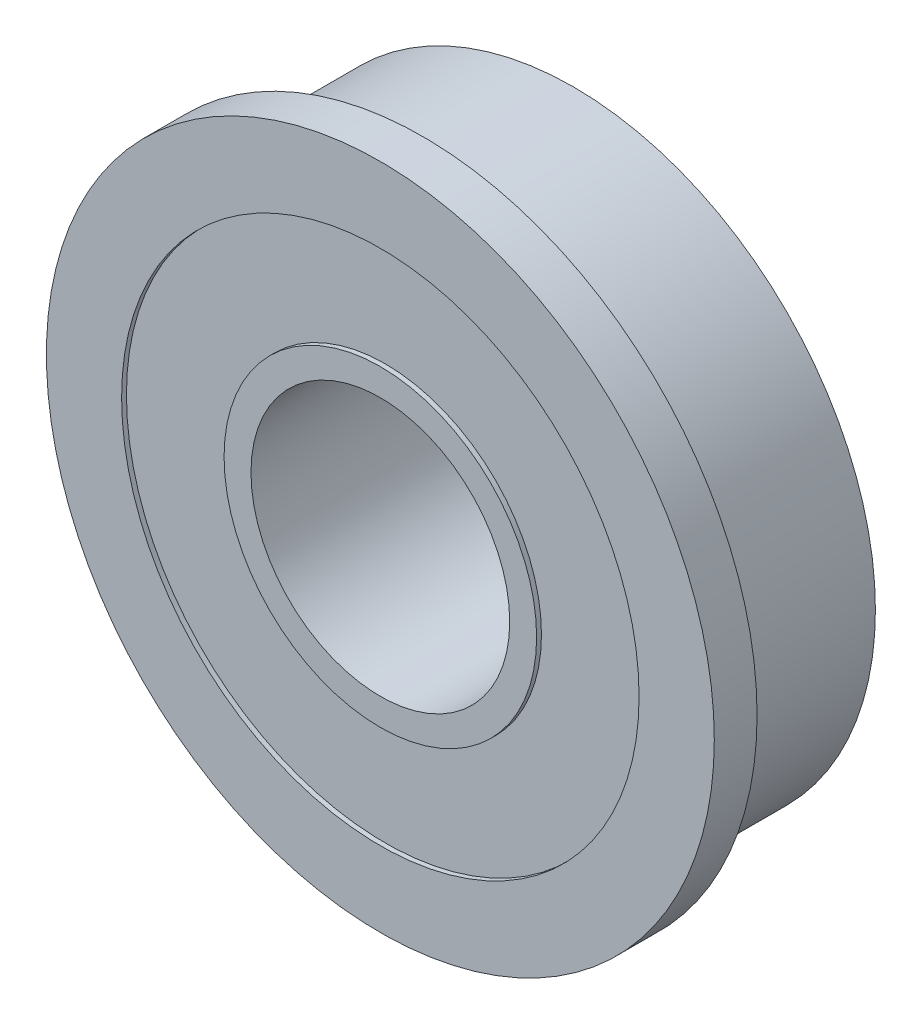
ISO-10303-21;
HEADER;
FILE_DESCRIPTION(('STEP AP214'),'2;1');
FILE_NAME('part.step','',(''),(''),'','','');
FILE_SCHEMA(('AUTOMOTIVE_DESIGN { 1 0 10303 214 1 1 1 1 }'));
ENDSEC;
DATA;
#1=APPLICATION_CONTEXT('core data for automotive mechanical design processes');
#2=APPLICATION_PROTOCOL_DEFINITION('international standard','automotive_design',2000,#1);
#3=PRODUCT_CONTEXT('',#1,'mechanical');
#4=PRODUCT('Part','Part','',(#3));
#5=PRODUCT_RELATED_PRODUCT_CATEGORY('part','',(#4));
#6=PRODUCT_DEFINITION_FORMATION('','',#4);
#7=PRODUCT_DEFINITION_CONTEXT('part definition',#1,'design');
#8=PRODUCT_DEFINITION('design','',#6,#7);
#9=PRODUCT_DEFINITION_SHAPE('','',#8);
#10=(LENGTH_UNIT() NAMED_UNIT(*) SI_UNIT(.MILLI.,.METRE.));
#11=(NAMED_UNIT(*) PLANE_ANGLE_UNIT() SI_UNIT($,.RADIAN.));
#12=(NAMED_UNIT(*) SI_UNIT($,.STERADIAN.) SOLID_ANGLE_UNIT());
#13=UNCERTAINTY_MEASURE_WITH_UNIT(LENGTH_MEASURE(1.E-05),#10,'distance_accuracy_value','');
#14=(GEOMETRIC_REPRESENTATION_CONTEXT(3) GLOBAL_UNCERTAINTY_ASSIGNED_CONTEXT((#13)) GLOBAL_UNIT_ASSIGNED_CONTEXT((#10,
#11,#12)) REPRESENTATION_CONTEXT('',''));
#15=CARTESIAN_POINT('',(0.,0.,0.));
#16=DIRECTION('',(0.,0.,1.));
#17=DIRECTION('',(1.,0.,0.));
#18=AXIS2_PLACEMENT_3D('',#15,#16,#17);
#19=CARTESIAN_POINT('',(0.,0.,-3.556));
#20=DIRECTION('',(0.,0.,1.));
#21=DIRECTION('',(1.,0.,0.));
#22=AXIS2_PLACEMENT_3D('',#19,#20,#21);
#23=CYLINDRICAL_SURFACE('',#22,4.7625);
#24=CARTESIAN_POINT('',(0.,0.,3.556));
#25=DIRECTION('',(0.,0.,1.));
#26=DIRECTION('',(1.,0.,0.));
#27=AXIS2_PLACEMENT_3D('',#24,#25,#26);
#28=CIRCLE('',#27,4.7625);
#29=CARTESIAN_POINT('',(4.7625,0.,3.556));
#30=VERTEX_POINT('',#29);
#31=EDGE_CURVE('E10',#30,#30,#28,.T.);
#32=ORIENTED_EDGE('',*,*,#31,.T.);
#33=EDGE_LOOP('',(#32));
#34=FACE_BOUND('',#33,.T.);
#35=CARTESIAN_POINT('',(0.,0.,-3.556));
#36=DIRECTION('',(0.,0.,1.));
#37=DIRECTION('',(1.,0.,0.));
#38=AXIS2_PLACEMENT_3D('',#35,#36,#37);
#39=CIRCLE('',#38,4.7625);
#40=CARTESIAN_POINT('',(4.7625,0.,-3.556));
#41=VERTEX_POINT('',#40);
#42=EDGE_CURVE('E77',#41,#41,#39,.T.);
#43=ORIENTED_EDGE('',*,*,#42,.F.);
#44=EDGE_LOOP('',(#43));
#45=FACE_BOUND('',#44,.T.);
#46=ADVANCED_FACE('F31',(#34,#45),#23,.F.);
#47=CARTESIAN_POINT('',(4.7625,0.,3.556));
#48=DIRECTION('',(0.,0.,1.));
#49=DIRECTION('',(1.,0.,0.));
#50=AXIS2_PLACEMENT_3D('',#47,#48,#49);
#51=PLANE('',#50);
#52=CARTESIAN_POINT('',(0.,0.,3.556));
#53=DIRECTION('',(0.,0.,1.));
#54=DIRECTION('',(1.,0.,0.));
#55=AXIS2_PLACEMENT_3D('',#52,#53,#54);
#56=CIRCLE('',#55,5.7531);
#57=CARTESIAN_POINT('',(5.7531,0.,3.556));
#58=VERTEX_POINT('',#57);
#59=EDGE_CURVE('E37',#58,#58,#56,.T.);
#60=ORIENTED_EDGE('',*,*,#59,.T.);
#61=EDGE_LOOP('',(#60));
#62=FACE_BOUND('',#61,.T.);
#63=ORIENTED_EDGE('',*,*,#31,.F.);
#64=EDGE_LOOP('',(#63));
#65=FACE_BOUND('',#64,.T.);
#66=ADVANCED_FACE('F85',(#62,#65),#51,.T.);
#67=CARTESIAN_POINT('',(0.,0.,-3.556));
#68=DIRECTION('',(0.,0.,1.));
#69=DIRECTION('',(1.,0.,0.));
#70=AXIS2_PLACEMENT_3D('',#67,#68,#69);
#71=CYLINDRICAL_SURFACE('',#70,5.7531);
#72=CARTESIAN_POINT('',(0.,0.,3.3782));
#73=DIRECTION('',(0.,0.,1.));
#74=DIRECTION('',(1.,0.,0.));
#75=AXIS2_PLACEMENT_3D('',#72,#73,#74);
#76=CIRCLE('',#75,5.7531);
#77=CARTESIAN_POINT('',(5.7531,0.,3.3782));
#78=VERTEX_POINT('',#77);
#79=EDGE_CURVE('E41',#78,#78,#76,.T.);
#80=ORIENTED_EDGE('',*,*,#79,.T.);
#81=EDGE_LOOP('',(#80));
#82=FACE_BOUND('',#81,.T.);
#83=ORIENTED_EDGE('',*,*,#59,.F.);
#84=EDGE_LOOP('',(#83));
#85=FACE_BOUND('',#84,.T.);
#86=ADVANCED_FACE('F89',(#82,#85),#71,.T.);
#87=CARTESIAN_POINT('',(5.7531,0.,3.3782));
#88=DIRECTION('',(0.,0.,1.));
#89=DIRECTION('',(1.,0.,0.));
#90=AXIS2_PLACEMENT_3D('',#87,#88,#89);
#91=PLANE('',#90);
#92=CARTESIAN_POINT('',(0.,0.,3.3782));
#93=DIRECTION('',(0.,0.,1.));
#94=DIRECTION('',(1.,0.,0.));
#95=AXIS2_PLACEMENT_3D('',#92,#93,#94);
#96=CIRCLE('',#95,9.525);
#97=CARTESIAN_POINT('',(9.525,0.,3.3782));
#98=VERTEX_POINT('',#97);
#99=EDGE_CURVE('E45',#98,#98,#96,.T.);
#100=ORIENTED_EDGE('',*,*,#99,.T.);
#101=EDGE_LOOP('',(#100));
#102=FACE_BOUND('',#101,.T.);
#103=ORIENTED_EDGE('',*,*,#79,.F.);
#104=EDGE_LOOP('',(#103));
#105=FACE_BOUND('',#104,.T.);
#106=ADVANCED_FACE('F93',(#102,#105),#91,.T.);
#107=CARTESIAN_POINT('',(0.,0.,-3.556));
#108=DIRECTION('',(0.,0.,1.));
#109=DIRECTION('',(1.,0.,0.));
#110=AXIS2_PLACEMENT_3D('',#107,#108,#109);
#111=CYLINDRICAL_SURFACE('',#110,9.525);
#112=CARTESIAN_POINT('',(0.,0.,3.556));
#113=DIRECTION('',(0.,0.,1.));
#114=DIRECTION('',(1.,0.,0.));
#115=AXIS2_PLACEMENT_3D('',#112,#113,#114);
#116=CIRCLE('',#115,9.525);
#117=CARTESIAN_POINT('',(9.525,0.,3.556));
#118=VERTEX_POINT('',#117);
#119=EDGE_CURVE('E50',#118,#118,#116,.T.);
#120=ORIENTED_EDGE('',*,*,#119,.T.);
#121=EDGE_LOOP('',(#120));
#122=FACE_BOUND('',#121,.T.);
#123=ORIENTED_EDGE('',*,*,#99,.F.);
#124=EDGE_LOOP('',(#123));
#125=FACE_BOUND('',#124,.T.);
#126=ADVANCED_FACE('F100',(#122,#125),#111,.F.);
#127=CARTESIAN_POINT('',(9.525,0.,3.556));
#128=DIRECTION('',(0.,0.,1.));
#129=DIRECTION('',(1.,0.,0.));
#130=AXIS2_PLACEMENT_3D('',#127,#128,#129);
#131=PLANE('',#130);
#132=CARTESIAN_POINT('',(0.,0.,3.556));
#133=DIRECTION('',(0.,0.,1.));
#134=DIRECTION('',(1.,0.,0.));
#135=AXIS2_PLACEMENT_3D('',#132,#133,#134);
#136=CIRCLE('',#135,12.2936);
#137=CARTESIAN_POINT('',(12.2936,0.,3.556));
#138=VERTEX_POINT('',#137);
#139=EDGE_CURVE('E53',#138,#138,#136,.T.);
#140=ORIENTED_EDGE('',*,*,#139,.T.);
#141=EDGE_LOOP('',(#140));
#142=FACE_BOUND('',#141,.T.);
#143=ORIENTED_EDGE('',*,*,#119,.F.);
#144=EDGE_LOOP('',(#143));
#145=FACE_BOUND('',#144,.T.);
#146=ADVANCED_FACE('F104',(#142,#145),#131,.T.);
#147=CARTESIAN_POINT('',(0.,0.,-3.556));
#148=DIRECTION('',(0.,0.,1.));
#149=DIRECTION('',(1.,0.,0.));
#150=AXIS2_PLACEMENT_3D('',#147,#148,#149);
#151=CYLINDRICAL_SURFACE('',#150,12.2936);
#152=CARTESIAN_POINT('',(0.,0.,1.9812));
#153=DIRECTION('',(0.,0.,1.));
#154=DIRECTION('',(1.,0.,0.));
#155=AXIS2_PLACEMENT_3D('',#152,#153,#154);
#156=CIRCLE('',#155,12.2936);
#157=CARTESIAN_POINT('',(12.2936,0.,1.9812));
#158=VERTEX_POINT('',#157);
#159=EDGE_CURVE('E56',#158,#158,#156,.T.);
#160=ORIENTED_EDGE('',*,*,#159,.T.);
#161=EDGE_LOOP('',(#160));
#162=FACE_BOUND('',#161,.T.);
#163=ORIENTED_EDGE('',*,*,#139,.F.);
#164=EDGE_LOOP('',(#163));
#165=FACE_BOUND('',#164,.T.);
#166=ADVANCED_FACE('F108',(#162,#165),#151,.T.);
#167=CARTESIAN_POINT('',(12.2936,0.,1.9812));
#168=DIRECTION('',(0.,0.,-1.));
#169=DIRECTION('',(-1.,0.,0.));
#170=AXIS2_PLACEMENT_3D('',#167,#168,#169);
#171=PLANE('',#170);
#172=CARTESIAN_POINT('',(0.,0.,1.9812));
#173=DIRECTION('',(0.,0.,1.));
#174=DIRECTION('',(1.,0.,0.));
#175=AXIS2_PLACEMENT_3D('',#172,#173,#174);
#176=CIRCLE('',#175,11.1125);
#177=CARTESIAN_POINT('',(11.1125,0.,1.9812));
#178=VERTEX_POINT('',#177);
#179=EDGE_CURVE('E59',#178,#178,#176,.T.);
#180=ORIENTED_EDGE('',*,*,#179,.T.);
#181=EDGE_LOOP('',(#180));
#182=FACE_BOUND('',#181,.T.);
#183=ORIENTED_EDGE('',*,*,#159,.F.);
#184=EDGE_LOOP('',(#183));
#185=FACE_BOUND('',#184,.T.);
#186=ADVANCED_FACE('F112',(#182,#185),#171,.T.);
#187=CARTESIAN_POINT('',(0.,0.,-3.556));
#188=DIRECTION('',(0.,0.,1.));
#189=DIRECTION('',(1.,0.,0.));
#190=AXIS2_PLACEMENT_3D('',#187,#188,#189);
#191=CYLINDRICAL_SURFACE('',#190,11.1125);
#192=CARTESIAN_POINT('',(0.,0.,-3.556));
#193=DIRECTION('',(0.,0.,1.));
#194=DIRECTION('',(1.,0.,0.));
#195=AXIS2_PLACEMENT_3D('',#192,#193,#194);
#196=CIRCLE('',#195,11.1125);
#197=CARTESIAN_POINT('',(11.1125,0.,-3.556));
#198=VERTEX_POINT('',#197);
#199=EDGE_CURVE('E62',#198,#198,#196,.T.);
#200=ORIENTED_EDGE('',*,*,#199,.T.);
#201=EDGE_LOOP('',(#200));
#202=FACE_BOUND('',#201,.T.);
#203=ORIENTED_EDGE('',*,*,#179,.F.);
#204=EDGE_LOOP('',(#203));
#205=FACE_BOUND('',#204,.T.);
#206=ADVANCED_FACE('F116',(#202,#205),#191,.T.);
#207=CARTESIAN_POINT('',(11.1125,0.,-3.556));
#208=DIRECTION('',(0.,0.,-1.));
#209=DIRECTION('',(-1.,0.,0.));
#210=AXIS2_PLACEMENT_3D('',#207,#208,#209);
#211=PLANE('',#210);
#212=CARTESIAN_POINT('',(0.,0.,-3.556));
#213=DIRECTION('',(0.,0.,1.));
#214=DIRECTION('',(1.,0.,0.));
#215=AXIS2_PLACEMENT_3D('',#212,#213,#214);
#216=CIRCLE('',#215,9.525);
#217=CARTESIAN_POINT('',(9.525,0.,-3.556));
#218=VERTEX_POINT('',#217);
#219=EDGE_CURVE('E65',#218,#218,#216,.T.);
#220=ORIENTED_EDGE('',*,*,#219,.T.);
#221=EDGE_LOOP('',(#220));
#222=FACE_BOUND('',#221,.T.);
#223=ORIENTED_EDGE('',*,*,#199,.F.);
#224=EDGE_LOOP('',(#223));
#225=FACE_BOUND('',#224,.T.);
#226=ADVANCED_FACE('F120',(#222,#225),#211,.T.);
#227=CARTESIAN_POINT('',(0.,0.,-3.556));
#228=DIRECTION('',(0.,0.,1.));
#229=DIRECTION('',(1.,0.,0.));
#230=AXIS2_PLACEMENT_3D('',#227,#228,#229);
#231=CYLINDRICAL_SURFACE('',#230,9.525);
#232=CARTESIAN_POINT('',(0.,0.,-3.3782));
#233=DIRECTION('',(0.,0.,1.));
#234=DIRECTION('',(1.,0.,0.));
#235=AXIS2_PLACEMENT_3D('',#232,#233,#234);
#236=CIRCLE('',#235,9.525);
#237=CARTESIAN_POINT('',(9.525,0.,-3.3782));
#238=VERTEX_POINT('',#237);
#239=EDGE_CURVE('E68',#238,#238,#236,.T.);
#240=ORIENTED_EDGE('',*,*,#239,.T.);
#241=EDGE_LOOP('',(#240));
#242=FACE_BOUND('',#241,.T.);
#243=ORIENTED_EDGE('',*,*,#219,.F.);
#244=EDGE_LOOP('',(#243));
#245=FACE_BOUND('',#244,.T.);
#246=ADVANCED_FACE('F124',(#242,#245),#231,.F.);
#247=CARTESIAN_POINT('',(9.525,0.,-3.3782));
#248=DIRECTION('',(0.,0.,-1.));
#249=DIRECTION('',(-1.,0.,0.));
#250=AXIS2_PLACEMENT_3D('',#247,#248,#249);
#251=PLANE('',#250);
#252=CARTESIAN_POINT('',(0.,0.,-3.3782));
#253=DIRECTION('',(0.,0.,1.));
#254=DIRECTION('',(1.,0.,0.));
#255=AXIS2_PLACEMENT_3D('',#252,#253,#254);
#256=CIRCLE('',#255,5.7531);
#257=CARTESIAN_POINT('',(5.7531,0.,-3.3782));
#258=VERTEX_POINT('',#257);
#259=EDGE_CURVE('E71',#258,#258,#256,.T.);
#260=ORIENTED_EDGE('',*,*,#259,.T.);
#261=EDGE_LOOP('',(#260));
#262=FACE_BOUND('',#261,.T.);
#263=ORIENTED_EDGE('',*,*,#239,.F.);
#264=EDGE_LOOP('',(#263));
#265=FACE_BOUND('',#264,.T.);
#266=ADVANCED_FACE('F128',(#262,#265),#251,.T.);
#267=CARTESIAN_POINT('',(0.,0.,-3.556));
#268=DIRECTION('',(0.,0.,1.));
#269=DIRECTION('',(1.,0.,0.));
#270=AXIS2_PLACEMENT_3D('',#267,#268,#269);
#271=CYLINDRICAL_SURFACE('',#270,5.7531);
#272=CARTESIAN_POINT('',(0.,0.,-3.556));
#273=DIRECTION('',(0.,0.,1.));
#274=DIRECTION('',(1.,0.,0.));
#275=AXIS2_PLACEMENT_3D('',#272,#273,#274);
#276=CIRCLE('',#275,5.7531);
#277=CARTESIAN_POINT('',(5.7531,0.,-3.556));
#278=VERTEX_POINT('',#277);
#279=EDGE_CURVE('E74',#278,#278,#276,.T.);
#280=ORIENTED_EDGE('',*,*,#279,.T.);
#281=EDGE_LOOP('',(#280));
#282=FACE_BOUND('',#281,.T.);
#283=ORIENTED_EDGE('',*,*,#259,.F.);
#284=EDGE_LOOP('',(#283));
#285=FACE_BOUND('',#284,.T.);
#286=ADVANCED_FACE('F132',(#282,#285),#271,.T.);
#287=CARTESIAN_POINT('',(5.7531,0.,-3.556));
#288=DIRECTION('',(0.,0.,-1.));
#289=DIRECTION('',(-1.,0.,0.));
#290=AXIS2_PLACEMENT_3D('',#287,#288,#289);
#291=PLANE('',#290);
#292=ORIENTED_EDGE('',*,*,#42,.T.);
#293=EDGE_LOOP('',(#292));
#294=FACE_BOUND('',#293,.T.);
#295=ORIENTED_EDGE('',*,*,#279,.F.);
#296=EDGE_LOOP('',(#295));
#297=FACE_BOUND('',#296,.T.);
#298=ADVANCED_FACE('F81',(#294,#297),#291,.T.);
#299=CLOSED_SHELL('',(#46,#66,#86,#106,#126,#146,#166,#186,#206,#226,#246,#266,#286,#298));
#300=MANIFOLD_SOLID_BREP('B2',#299);
#301=ADVANCED_BREP_SHAPE_REPRESENTATION('',(#18,#300),#14);
#302=SHAPE_DEFINITION_REPRESENTATION(#9,#301);
ENDSEC;
END-ISO-10303-21;
